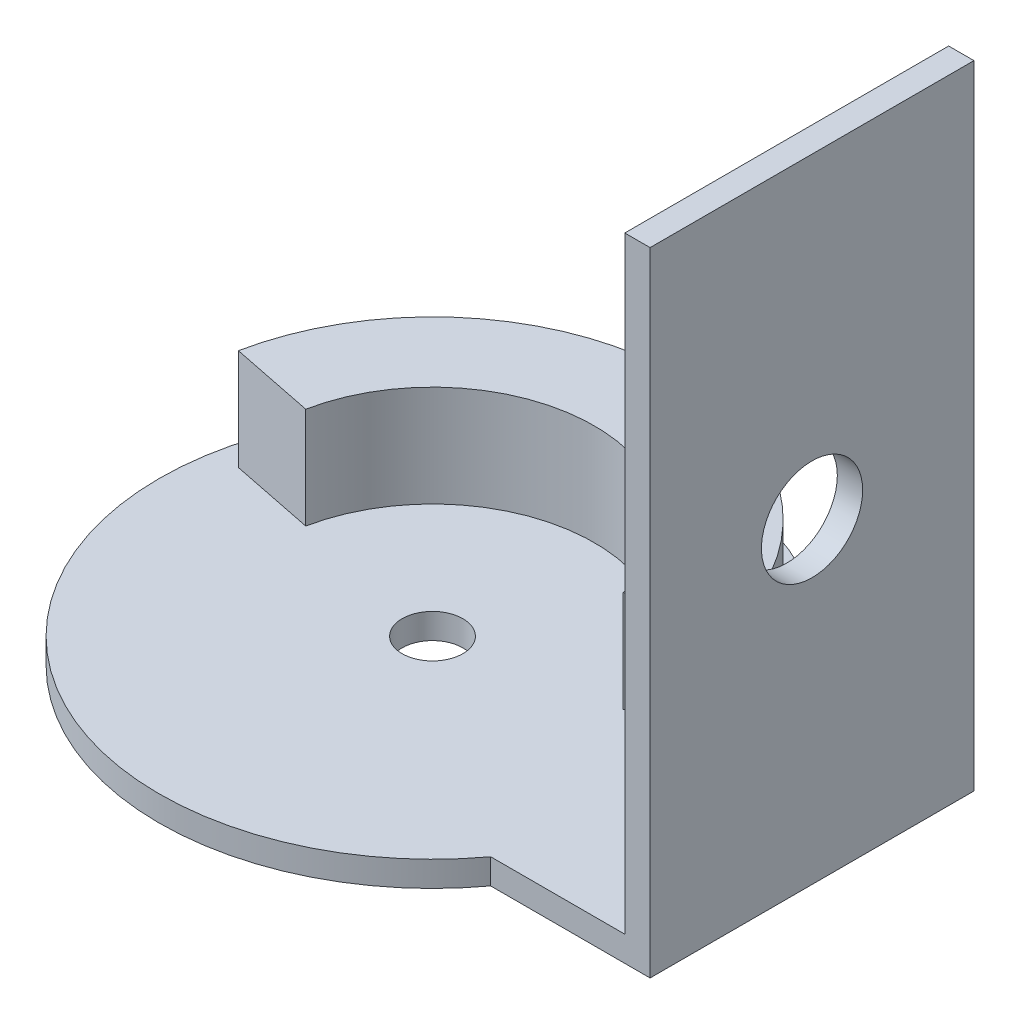
ISO-10303-21;
HEADER;
FILE_DESCRIPTION(('STEP AP214'),'2;1');
FILE_NAME('part.step','',(''),(''),'','','');
FILE_SCHEMA(('AUTOMOTIVE_DESIGN { 1 0 10303 214 1 1 1 1 }'));
ENDSEC;
DATA;
#1=APPLICATION_CONTEXT('core data for automotive mechanical design processes');
#2=APPLICATION_PROTOCOL_DEFINITION('international standard','automotive_design',2000,#1);
#3=PRODUCT_CONTEXT('',#1,'mechanical');
#4=PRODUCT('Part','Part','',(#3));
#5=PRODUCT_RELATED_PRODUCT_CATEGORY('part','',(#4));
#6=PRODUCT_DEFINITION_FORMATION('','',#4);
#7=PRODUCT_DEFINITION_CONTEXT('part definition',#1,'design');
#8=PRODUCT_DEFINITION('design','',#6,#7);
#9=PRODUCT_DEFINITION_SHAPE('','',#8);
#10=(LENGTH_UNIT() NAMED_UNIT(*) SI_UNIT(.MILLI.,.METRE.));
#11=(NAMED_UNIT(*) PLANE_ANGLE_UNIT() SI_UNIT($,.RADIAN.));
#12=(NAMED_UNIT(*) SI_UNIT($,.STERADIAN.) SOLID_ANGLE_UNIT());
#13=UNCERTAINTY_MEASURE_WITH_UNIT(LENGTH_MEASURE(1.E-05),#10,'distance_accuracy_value','');
#14=(GEOMETRIC_REPRESENTATION_CONTEXT(3) GLOBAL_UNCERTAINTY_ASSIGNED_CONTEXT((#13)) GLOBAL_UNIT_ASSIGNED_CONTEXT((#10,
#11,#12)) REPRESENTATION_CONTEXT('',''));
#15=CARTESIAN_POINT('',(0.,0.,0.));
#16=DIRECTION('',(0.,0.,1.));
#17=DIRECTION('',(1.,0.,0.));
#18=AXIS2_PLACEMENT_3D('',#15,#16,#17);
#19=CARTESIAN_POINT('',(-2.46330733588707E-13,0.,4.85722573273506E-13));
#20=DIRECTION('',(0.,1.,0.));
#21=DIRECTION('',(0.,0.,1.));
#22=AXIS2_PLACEMENT_3D('',#19,#20,#21);
#23=PLANE('',#22);
#24=CARTESIAN_POINT('',(0.,0.,0.));
#25=DIRECTION('',(0.,-1.,0.));
#26=DIRECTION('',(0.,0.,-1.));
#27=AXIS2_PLACEMENT_3D('',#24,#25,#26);
#28=CIRCLE('',#27,3.);
#29=CARTESIAN_POINT('',(0.,0.,-3.));
#30=VERTEX_POINT('',#29);
#31=EDGE_CURVE('E260',#30,#30,#28,.T.);
#32=ORIENTED_EDGE('',*,*,#31,.T.);
#33=EDGE_LOOP('',(#32));
#34=FACE_BOUND('',#33,.T.);
#35=DIRECTION('',(0.980296668202732,0.,0.19753086419753));
#36=VECTOR('',#35,1.);
#37=CARTESIAN_POINT('',(-24.017268370967,0.,-4.83950617283951));
#38=LINE('',#37,#36);
#39=CARTESIAN_POINT('',(-24.017268370967,0.,-4.8395061728395));
#40=VERTEX_POINT('',#39);
#41=CARTESIAN_POINT('',(-15.6847466912437,0.,-3.16049382716048));
#42=VERTEX_POINT('',#41);
#43=EDGE_CURVE('E87',#40,#42,#38,.T.);
#44=ORIENTED_EDGE('',*,*,#43,.F.);
#45=CARTESIAN_POINT('',(0.,0.,1.28369537222284E-13));
#46=DIRECTION('',(0.,-1.,0.));
#47=DIRECTION('',(0.,0.,-1.));
#48=AXIS2_PLACEMENT_3D('',#45,#46,#47);
#49=CIRCLE('',#48,24.5000000000001);
#50=CARTESIAN_POINT('',(24.017268370967,0.,-4.8395061728395));
#51=VERTEX_POINT('',#50);
#52=EDGE_CURVE('E122',#40,#51,#49,.T.);
#53=ORIENTED_EDGE('',*,*,#52,.T.);
#54=DIRECTION('',(-0.980296668202732,0.,0.19753086419753));
#55=VECTOR('',#54,1.);
#56=CARTESIAN_POINT('',(24.017268370967,0.,-4.83950617283951));
#57=LINE('',#56,#55);
#58=CARTESIAN_POINT('',(15.6847466912437,0.,-3.16049382716049));
#59=VERTEX_POINT('',#58);
#60=EDGE_CURVE('E79',#51,#59,#57,.T.);
#61=ORIENTED_EDGE('',*,*,#60,.T.);
#62=CARTESIAN_POINT('',(0.,0.,0.));
#63=DIRECTION('',(0.,-1.,0.));
#64=DIRECTION('',(0.,0.,-1.));
#65=AXIS2_PLACEMENT_3D('',#62,#63,#64);
#66=CIRCLE('',#65,16.);
#67=EDGE_CURVE('E107',#42,#59,#66,.T.);
#68=ORIENTED_EDGE('',*,*,#67,.F.);
#69=EDGE_LOOP('',(#44,#53,#61,#68));
#70=FACE_BOUND('',#69,.T.);
#71=DIRECTION('',(-1.,0.,0.));
#72=VECTOR('',#71,1.);
#73=CARTESIAN_POINT('',(21.7485631709316,0.,16.));
#74=LINE('',#73,#72);
#75=CARTESIAN_POINT('',(35.,0.,16.));
#76=VERTEX_POINT('',#75);
#77=CARTESIAN_POINT('',(21.7485631709316,0.,16.));
#78=VERTEX_POINT('',#77);
#79=EDGE_CURVE('E133',#76,#78,#74,.T.);
#80=ORIENTED_EDGE('',*,*,#79,.F.);
#81=DIRECTION('',(0.,0.,1.));
#82=VECTOR('',#81,1.);
#83=CARTESIAN_POINT('',(35.,0.,16.));
#84=LINE('',#83,#82);
#85=CARTESIAN_POINT('',(35.,0.,-16.));
#86=VERTEX_POINT('',#85);
#87=EDGE_CURVE('E136',#86,#76,#84,.T.);
#88=ORIENTED_EDGE('',*,*,#87,.F.);
#89=DIRECTION('',(1.,0.,0.));
#90=VECTOR('',#89,1.);
#91=CARTESIAN_POINT('',(21.7485631709316,0.,-16.));
#92=LINE('',#91,#90);
#93=CARTESIAN_POINT('',(21.7485631709316,0.,-16.));
#94=VERTEX_POINT('',#93);
#95=EDGE_CURVE('E143',#94,#86,#92,.T.);
#96=ORIENTED_EDGE('',*,*,#95,.F.);
#97=CARTESIAN_POINT('',(0.,0.,0.));
#98=DIRECTION('',(0.,-1.,0.));
#99=DIRECTION('',(0.,0.,1.));
#100=AXIS2_PLACEMENT_3D('',#97,#98,#99);
#101=CIRCLE('',#100,27.);
#102=EDGE_CURVE('E140',#78,#94,#101,.T.);
#103=ORIENTED_EDGE('',*,*,#102,.F.);
#104=EDGE_LOOP('',(#80,#88,#96,#103));
#105=FACE_BOUND('',#104,.T.);
#106=ADVANCED_FACE('F40',(#34,#70,#105),#23,.T.);
#107=CARTESIAN_POINT('',(-24.017268370967,10.,-4.83950617283951));
#108=DIRECTION('',(0.19753086419753,0.,-0.980296668202732));
#109=DIRECTION('',(-0.980296668202732,0.,-0.19753086419753));
#110=AXIS2_PLACEMENT_3D('',#107,#108,#109);
#111=PLANE('',#110);
#112=ORIENTED_EDGE('',*,*,#43,.T.);
#113=DIRECTION('',(0.,-1.,0.));
#114=VECTOR('',#113,1.);
#115=CARTESIAN_POINT('',(-15.6847466912437,10.,-3.16049382716048));
#116=LINE('',#115,#114);
#117=CARTESIAN_POINT('',(-15.6847466912437,10.,-3.16049382716048));
#118=VERTEX_POINT('',#117);
#119=EDGE_CURVE('E11',#118,#42,#116,.T.);
#120=ORIENTED_EDGE('',*,*,#119,.F.);
#121=DIRECTION('',(0.980296668202732,0.,0.19753086419753));
#122=VECTOR('',#121,1.);
#123=CARTESIAN_POINT('',(-24.017268370967,10.,-4.83950617283951));
#124=LINE('',#123,#122);
#125=CARTESIAN_POINT('',(-24.017268370967,10.,-4.8395061728395));
#126=VERTEX_POINT('',#125);
#127=EDGE_CURVE('E101',#126,#118,#124,.T.);
#128=ORIENTED_EDGE('',*,*,#127,.F.);
#129=DIRECTION('',(0.,-1.,0.));
#130=VECTOR('',#129,1.);
#131=CARTESIAN_POINT('',(-24.017268370967,10.,-4.8395061728395));
#132=LINE('',#131,#130);
#133=EDGE_CURVE('E65',#126,#40,#132,.T.);
#134=ORIENTED_EDGE('',*,*,#133,.T.);
#135=EDGE_LOOP('',(#112,#120,#128,#134));
#136=FACE_BOUND('',#135,.T.);
#137=ADVANCED_FACE('F42',(#136),#111,.F.);
#138=CARTESIAN_POINT('',(0.,10.,0.));
#139=DIRECTION('',(0.,-1.,0.));
#140=DIRECTION('',(0.,0.,-1.));
#141=AXIS2_PLACEMENT_3D('',#138,#139,#140);
#142=CYLINDRICAL_SURFACE('',#141,16.);
#143=ORIENTED_EDGE('',*,*,#67,.T.);
#144=DIRECTION('',(0.,-1.,0.));
#145=VECTOR('',#144,1.);
#146=CARTESIAN_POINT('',(15.6847466912437,10.,-3.16049382716049));
#147=LINE('',#146,#145);
#148=CARTESIAN_POINT('',(15.6847466912437,10.,-3.16049382716049));
#149=VERTEX_POINT('',#148);
#150=EDGE_CURVE('E49',#149,#59,#147,.T.);
#151=ORIENTED_EDGE('',*,*,#150,.F.);
#152=CARTESIAN_POINT('',(0.,10.,0.));
#153=DIRECTION('',(0.,-1.,0.));
#154=DIRECTION('',(0.,0.,-1.));
#155=AXIS2_PLACEMENT_3D('',#152,#153,#154);
#156=CIRCLE('',#155,16.);
#157=EDGE_CURVE('E95',#118,#149,#156,.T.);
#158=ORIENTED_EDGE('',*,*,#157,.F.);
#159=ORIENTED_EDGE('',*,*,#119,.T.);
#160=EDGE_LOOP('',(#143,#151,#158,#159));
#161=FACE_BOUND('',#160,.T.);
#162=ADVANCED_FACE('F106',(#161),#142,.F.);
#163=CARTESIAN_POINT('',(24.017268370967,10.,-4.83950617283951));
#164=DIRECTION('',(0.19753086419753,0.,0.980296668202732));
#165=DIRECTION('',(0.980296668202732,0.,-0.19753086419753));
#166=AXIS2_PLACEMENT_3D('',#163,#164,#165);
#167=PLANE('',#166);
#168=ORIENTED_EDGE('',*,*,#60,.F.);
#169=DIRECTION('',(0.,-1.,0.));
#170=VECTOR('',#169,1.);
#171=CARTESIAN_POINT('',(24.017268370967,10.,-4.8395061728395));
#172=LINE('',#171,#170);
#173=CARTESIAN_POINT('',(24.017268370967,10.,-4.8395061728395));
#174=VERTEX_POINT('',#173);
#175=EDGE_CURVE('E109',#174,#51,#172,.T.);
#176=ORIENTED_EDGE('',*,*,#175,.F.);
#177=DIRECTION('',(-0.980296668202732,0.,0.19753086419753));
#178=VECTOR('',#177,1.);
#179=CARTESIAN_POINT('',(24.017268370967,10.,-4.83950617283951));
#180=LINE('',#179,#178);
#181=EDGE_CURVE('E100',#174,#149,#180,.T.);
#182=ORIENTED_EDGE('',*,*,#181,.T.);
#183=ORIENTED_EDGE('',*,*,#150,.T.);
#184=EDGE_LOOP('',(#168,#176,#182,#183));
#185=FACE_BOUND('',#184,.T.);
#186=ADVANCED_FACE('F111',(#185),#167,.T.);
#187=CARTESIAN_POINT('',(0.,10.,1.28369537222284E-13));
#188=DIRECTION('',(0.,-1.,0.));
#189=DIRECTION('',(0.,0.,-1.));
#190=AXIS2_PLACEMENT_3D('',#187,#188,#189);
#191=CYLINDRICAL_SURFACE('',#190,24.5000000000001);
#192=ORIENTED_EDGE('',*,*,#52,.F.);
#193=ORIENTED_EDGE('',*,*,#133,.F.);
#194=CARTESIAN_POINT('',(0.,10.,1.28369537222284E-13));
#195=DIRECTION('',(0.,-1.,0.));
#196=DIRECTION('',(0.,0.,-1.));
#197=AXIS2_PLACEMENT_3D('',#194,#195,#196);
#198=CIRCLE('',#197,24.5000000000001);
#199=EDGE_CURVE('E113',#126,#174,#198,.T.);
#200=ORIENTED_EDGE('',*,*,#199,.T.);
#201=ORIENTED_EDGE('',*,*,#175,.T.);
#202=EDGE_LOOP('',(#192,#193,#200,#201));
#203=FACE_BOUND('',#202,.T.);
#204=ADVANCED_FACE('F125',(#203),#191,.T.);
#205=CARTESIAN_POINT('',(0.,10.,0.));
#206=DIRECTION('',(0.,-1.,0.));
#207=DIRECTION('',(0.,0.,-1.));
#208=AXIS2_PLACEMENT_3D('',#205,#206,#207);
#209=PLANE('',#208);
#210=ORIENTED_EDGE('',*,*,#127,.T.);
#211=ORIENTED_EDGE('',*,*,#157,.T.);
#212=ORIENTED_EDGE('',*,*,#181,.F.);
#213=ORIENTED_EDGE('',*,*,#199,.F.);
#214=EDGE_LOOP('',(#210,#211,#212,#213));
#215=FACE_BOUND('',#214,.T.);
#216=ADVANCED_FACE('F97',(#215),#209,.F.);
#217=CARTESIAN_POINT('',(-2.46330733588707E-13,-2.5,4.85722573273506E-13));
#218=DIRECTION('',(0.,1.,0.));
#219=DIRECTION('',(0.,0.,1.));
#220=AXIS2_PLACEMENT_3D('',#217,#218,#219);
#221=PLANE('',#220);
#222=CARTESIAN_POINT('',(-2.46330733588707E-13,-2.5,4.85722573273506E-13));
#223=DIRECTION('',(0.,-1.,0.));
#224=DIRECTION('',(0.,0.,1.));
#225=AXIS2_PLACEMENT_3D('',#222,#223,#224);
#226=CIRCLE('',#225,27.0000000000005);
#227=CARTESIAN_POINT('',(21.7485631709316,-2.5,16.));
#228=VERTEX_POINT('',#227);
#229=CARTESIAN_POINT('',(21.7485631709316,-2.5,-16.));
#230=VERTEX_POINT('',#229);
#231=EDGE_CURVE('E145',#228,#230,#226,.T.);
#232=ORIENTED_EDGE('',*,*,#231,.T.);
#233=DIRECTION('',(1.,0.,0.));
#234=VECTOR('',#233,1.);
#235=CARTESIAN_POINT('',(21.7485631709316,-2.5,-16.));
#236=LINE('',#235,#234);
#237=CARTESIAN_POINT('',(37.5,-2.5,-16.));
#238=VERTEX_POINT('',#237);
#239=EDGE_CURVE('E170',#230,#238,#236,.T.);
#240=ORIENTED_EDGE('',*,*,#239,.T.);
#241=DIRECTION('',(0.,0.,1.));
#242=VECTOR('',#241,1.);
#243=CARTESIAN_POINT('',(37.5,-2.5,-16.));
#244=LINE('',#243,#242);
#245=CARTESIAN_POINT('',(37.5,-2.5,16.));
#246=VERTEX_POINT('',#245);
#247=EDGE_CURVE('E267',#238,#246,#244,.T.);
#248=ORIENTED_EDGE('',*,*,#247,.T.);
#249=DIRECTION('',(-1.,0.,0.));
#250=VECTOR('',#249,1.);
#251=CARTESIAN_POINT('',(21.7485631709316,-2.5,16.));
#252=LINE('',#251,#250);
#253=EDGE_CURVE('E154',#246,#228,#252,.T.);
#254=ORIENTED_EDGE('',*,*,#253,.T.);
#255=EDGE_LOOP('',(#232,#240,#248,#254));
#256=FACE_BOUND('',#255,.T.);
#257=CARTESIAN_POINT('',(0.,-2.5,0.));
#258=DIRECTION('',(0.,-1.,0.));
#259=DIRECTION('',(0.,0.,-1.));
#260=AXIS2_PLACEMENT_3D('',#257,#258,#259);
#261=CIRCLE('',#260,3.);
#262=CARTESIAN_POINT('',(0.,-2.5,-3.));
#263=VERTEX_POINT('',#262);
#264=EDGE_CURVE('E147',#263,#263,#261,.T.);
#265=ORIENTED_EDGE('',*,*,#264,.F.);
#266=EDGE_LOOP('',(#265));
#267=FACE_BOUND('',#266,.T.);
#268=ADVANCED_FACE('F203',(#256,#267),#221,.F.);
#269=CARTESIAN_POINT('',(21.7485631709316,-2.5,-16.));
#270=DIRECTION('',(0.,0.,1.));
#271=DIRECTION('',(1.,0.,0.));
#272=AXIS2_PLACEMENT_3D('',#269,#270,#271);
#273=PLANE('',#272);
#274=ORIENTED_EDGE('',*,*,#95,.T.);
#275=DIRECTION('',(0.,-1.,0.));
#276=VECTOR('',#275,1.);
#277=CARTESIAN_POINT('',(35.,60.,-16.));
#278=LINE('',#277,#276);
#279=CARTESIAN_POINT('',(35.,60.,-16.));
#280=VERTEX_POINT('',#279);
#281=EDGE_CURVE('E257',#280,#86,#278,.T.);
#282=ORIENTED_EDGE('',*,*,#281,.F.);
#283=DIRECTION('',(-1.,0.,0.));
#284=VECTOR('',#283,1.);
#285=CARTESIAN_POINT('',(37.5,60.,-16.));
#286=LINE('',#285,#284);
#287=CARTESIAN_POINT('',(37.5,60.,-16.));
#288=VERTEX_POINT('',#287);
#289=EDGE_CURVE('E247',#288,#280,#286,.T.);
#290=ORIENTED_EDGE('',*,*,#289,.F.);
#291=DIRECTION('',(0.,1.,0.));
#292=VECTOR('',#291,1.);
#293=CARTESIAN_POINT('',(37.5,-2.5,-16.));
#294=LINE('',#293,#292);
#295=EDGE_CURVE('E157',#238,#288,#294,.T.);
#296=ORIENTED_EDGE('',*,*,#295,.F.);
#297=ORIENTED_EDGE('',*,*,#239,.F.);
#298=DIRECTION('',(0.,1.,0.));
#299=VECTOR('',#298,1.);
#300=CARTESIAN_POINT('',(21.7485631709316,-2.5,-16.));
#301=LINE('',#300,#299);
#302=EDGE_CURVE('E119',#230,#94,#301,.T.);
#303=ORIENTED_EDGE('',*,*,#302,.T.);
#304=EDGE_LOOP('',(#274,#282,#290,#296,#297,#303));
#305=FACE_BOUND('',#304,.T.);
#306=ADVANCED_FACE('F165',(#305),#273,.F.);
#307=CARTESIAN_POINT('',(37.5,-2.5,-16.));
#308=DIRECTION('',(-1.,0.,0.));
#309=DIRECTION('',(0.,0.,1.));
#310=AXIS2_PLACEMENT_3D('',#307,#308,#309);
#311=PLANE('',#310);
#312=CARTESIAN_POINT('',(37.5,28.75,0.));
#313=DIRECTION('',(1.,0.,0.));
#314=DIRECTION('',(0.,0.,-1.));
#315=AXIS2_PLACEMENT_3D('',#312,#313,#314);
#316=CIRCLE('',#315,5.);
#317=CARTESIAN_POINT('',(37.5,28.75,-5.));
#318=VERTEX_POINT('',#317);
#319=EDGE_CURVE('E238',#318,#318,#316,.T.);
#320=ORIENTED_EDGE('',*,*,#319,.F.);
#321=EDGE_LOOP('',(#320));
#322=FACE_BOUND('',#321,.T.);
#323=ORIENTED_EDGE('',*,*,#295,.T.);
#324=DIRECTION('',(0.,0.,-1.));
#325=VECTOR('',#324,1.);
#326=CARTESIAN_POINT('',(37.5,60.,16.));
#327=LINE('',#326,#325);
#328=CARTESIAN_POINT('',(37.5,60.,16.));
#329=VERTEX_POINT('',#328);
#330=EDGE_CURVE('E241',#329,#288,#327,.T.);
#331=ORIENTED_EDGE('',*,*,#330,.F.);
#332=DIRECTION('',(0.,1.,0.));
#333=VECTOR('',#332,1.);
#334=CARTESIAN_POINT('',(37.5,-2.5,16.));
#335=LINE('',#334,#333);
#336=EDGE_CURVE('E153',#246,#329,#335,.T.);
#337=ORIENTED_EDGE('',*,*,#336,.F.);
#338=ORIENTED_EDGE('',*,*,#247,.F.);
#339=EDGE_LOOP('',(#323,#331,#337,#338));
#340=FACE_BOUND('',#339,.T.);
#341=ADVANCED_FACE('F206',(#322,#340),#311,.F.);
#342=CARTESIAN_POINT('',(21.7485631709316,-2.5,16.));
#343=DIRECTION('',(0.,0.,-1.));
#344=DIRECTION('',(-1.,0.,0.));
#345=AXIS2_PLACEMENT_3D('',#342,#343,#344);
#346=PLANE('',#345);
#347=ORIENTED_EDGE('',*,*,#336,.T.);
#348=DIRECTION('',(1.,0.,0.));
#349=VECTOR('',#348,1.);
#350=CARTESIAN_POINT('',(37.5,60.,16.));
#351=LINE('',#350,#349);
#352=CARTESIAN_POINT('',(35.,60.,16.));
#353=VERTEX_POINT('',#352);
#354=EDGE_CURVE('E253',#353,#329,#351,.T.);
#355=ORIENTED_EDGE('',*,*,#354,.F.);
#356=DIRECTION('',(0.,-1.,0.));
#357=VECTOR('',#356,1.);
#358=CARTESIAN_POINT('',(35.,60.,16.));
#359=LINE('',#358,#357);
#360=EDGE_CURVE('E56',#353,#76,#359,.T.);
#361=ORIENTED_EDGE('',*,*,#360,.T.);
#362=ORIENTED_EDGE('',*,*,#79,.T.);
#363=DIRECTION('',(0.,1.,0.));
#364=VECTOR('',#363,1.);
#365=CARTESIAN_POINT('',(21.7485631709316,-2.5,16.));
#366=LINE('',#365,#364);
#367=EDGE_CURVE('E151',#228,#78,#366,.T.);
#368=ORIENTED_EDGE('',*,*,#367,.F.);
#369=ORIENTED_EDGE('',*,*,#253,.F.);
#370=EDGE_LOOP('',(#347,#355,#361,#362,#368,#369));
#371=FACE_BOUND('',#370,.T.);
#372=ADVANCED_FACE('F209',(#371),#346,.F.);
#373=CARTESIAN_POINT('',(0.,-2.5,0.));
#374=DIRECTION('',(0.,1.,0.));
#375=DIRECTION('',(0.,0.,1.));
#376=AXIS2_PLACEMENT_3D('',#373,#374,#375);
#377=CYLINDRICAL_SURFACE('',#376,27.);
#378=ORIENTED_EDGE('',*,*,#102,.T.);
#379=ORIENTED_EDGE('',*,*,#302,.F.);
#380=ORIENTED_EDGE('',*,*,#231,.F.);
#381=ORIENTED_EDGE('',*,*,#367,.T.);
#382=EDGE_LOOP('',(#378,#379,#380,#381));
#383=FACE_BOUND('',#382,.T.);
#384=ADVANCED_FACE('F176',(#383),#377,.T.);
#385=CARTESIAN_POINT('',(0.,-2.5,0.));
#386=DIRECTION('',(0.,1.,0.));
#387=DIRECTION('',(0.,0.,1.));
#388=AXIS2_PLACEMENT_3D('',#385,#386,#387);
#389=CYLINDRICAL_SURFACE('',#388,3.);
#390=ORIENTED_EDGE('',*,*,#264,.T.);
#391=EDGE_LOOP('',(#390));
#392=FACE_BOUND('',#391,.T.);
#393=ORIENTED_EDGE('',*,*,#31,.F.);
#394=EDGE_LOOP('',(#393));
#395=FACE_BOUND('',#394,.T.);
#396=ADVANCED_FACE('F214',(#392,#395),#389,.F.);
#397=CARTESIAN_POINT('',(35.,60.,16.));
#398=DIRECTION('',(1.,0.,0.));
#399=DIRECTION('',(0.,0.,-1.));
#400=AXIS2_PLACEMENT_3D('',#397,#398,#399);
#401=PLANE('',#400);
#402=CARTESIAN_POINT('',(35.,28.75,0.));
#403=DIRECTION('',(1.,0.,0.));
#404=DIRECTION('',(0.,0.,-1.));
#405=AXIS2_PLACEMENT_3D('',#402,#403,#404);
#406=CIRCLE('',#405,5.);
#407=CARTESIAN_POINT('',(35.,28.75,-5.));
#408=VERTEX_POINT('',#407);
#409=EDGE_CURVE('E44',#408,#408,#406,.T.);
#410=ORIENTED_EDGE('',*,*,#409,.T.);
#411=EDGE_LOOP('',(#410));
#412=FACE_BOUND('',#411,.T.);
#413=ORIENTED_EDGE('',*,*,#87,.T.);
#414=ORIENTED_EDGE('',*,*,#360,.F.);
#415=DIRECTION('',(0.,0.,1.));
#416=VECTOR('',#415,1.);
#417=CARTESIAN_POINT('',(35.,60.,16.));
#418=LINE('',#417,#416);
#419=EDGE_CURVE('E250',#280,#353,#418,.T.);
#420=ORIENTED_EDGE('',*,*,#419,.F.);
#421=ORIENTED_EDGE('',*,*,#281,.T.);
#422=EDGE_LOOP('',(#413,#414,#420,#421));
#423=FACE_BOUND('',#422,.T.);
#424=ADVANCED_FACE('F221',(#412,#423),#401,.F.);
#425=CARTESIAN_POINT('',(0.,60.,0.));
#426=DIRECTION('',(0.,1.,0.));
#427=DIRECTION('',(0.,0.,1.));
#428=AXIS2_PLACEMENT_3D('',#425,#426,#427);
#429=PLANE('',#428);
#430=ORIENTED_EDGE('',*,*,#330,.T.);
#431=ORIENTED_EDGE('',*,*,#289,.T.);
#432=ORIENTED_EDGE('',*,*,#419,.T.);
#433=ORIENTED_EDGE('',*,*,#354,.T.);
#434=EDGE_LOOP('',(#430,#431,#432,#433));
#435=FACE_BOUND('',#434,.T.);
#436=ADVANCED_FACE('F225',(#435),#429,.T.);
#437=CARTESIAN_POINT('',(27.5,28.75,0.));
#438=DIRECTION('',(1.,0.,0.));
#439=DIRECTION('',(0.,0.,-1.));
#440=AXIS2_PLACEMENT_3D('',#437,#438,#439);
#441=CYLINDRICAL_SURFACE('',#440,5.);
#442=ORIENTED_EDGE('',*,*,#319,.T.);
#443=EDGE_LOOP('',(#442));
#444=FACE_BOUND('',#443,.T.);
#445=ORIENTED_EDGE('',*,*,#409,.F.);
#446=EDGE_LOOP('',(#445));
#447=FACE_BOUND('',#446,.T.);
#448=ADVANCED_FACE('F229',(#444,#447),#441,.F.);
#449=CLOSED_SHELL('',(#106,#137,#162,#186,#204,#216,#268,#306,#341,#372,#384,#396,#424,#436,#448));
#450=MANIFOLD_SOLID_BREP('B2',#449);
#451=ADVANCED_BREP_SHAPE_REPRESENTATION('',(#18,#450),#14);
#452=SHAPE_DEFINITION_REPRESENTATION(#9,#451);
ENDSEC;
END-ISO-10303-21;
